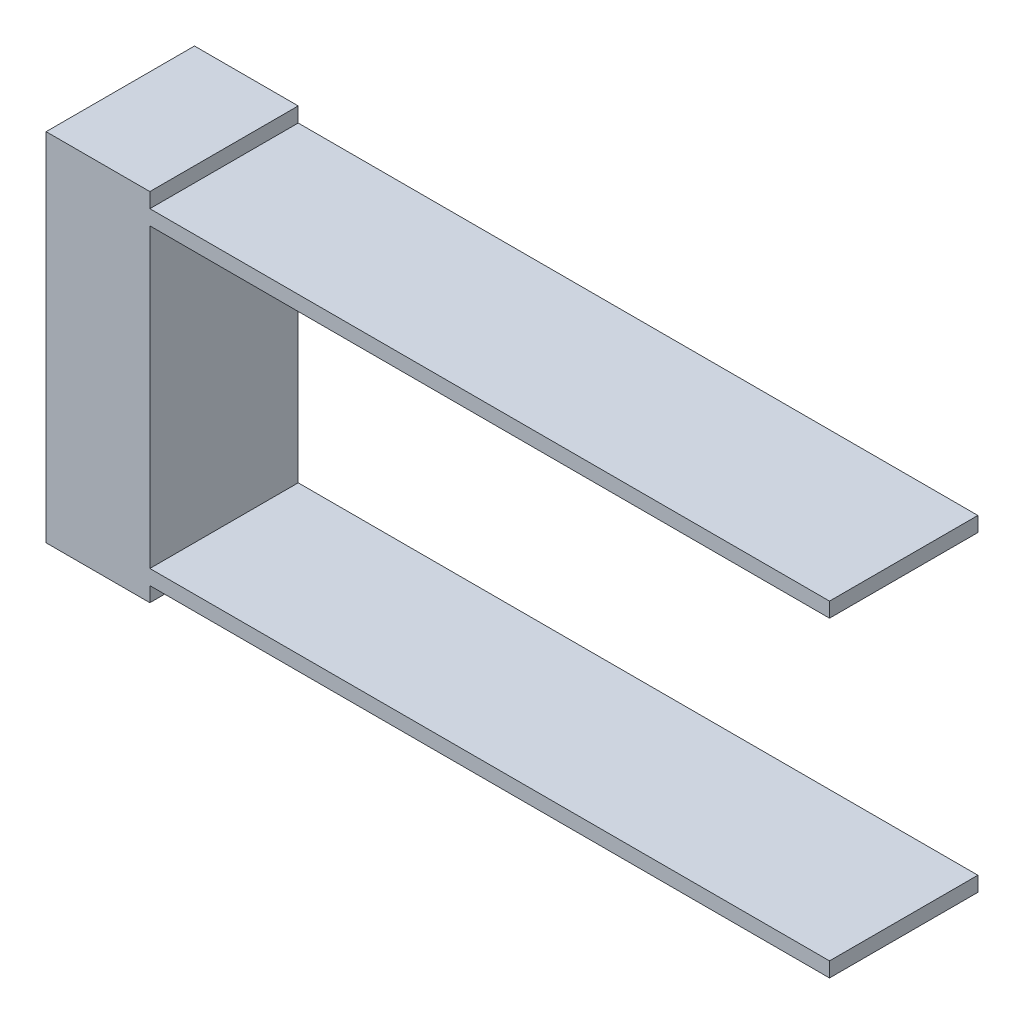
ISO-10303-21;
HEADER;
FILE_DESCRIPTION(('STEP AP214'),'2;1');
FILE_NAME('part.step','',(''),(''),'','','');
FILE_SCHEMA(('AUTOMOTIVE_DESIGN { 1 0 10303 214 1 1 1 1 }'));
ENDSEC;
DATA;
#1=APPLICATION_CONTEXT('core data for automotive mechanical design processes');
#2=APPLICATION_PROTOCOL_DEFINITION('international standard','automotive_design',2000,#1);
#3=PRODUCT_CONTEXT('',#1,'mechanical');
#4=PRODUCT('Part','Part','',(#3));
#5=PRODUCT_RELATED_PRODUCT_CATEGORY('part','',(#4));
#6=PRODUCT_DEFINITION_FORMATION('','',#4);
#7=PRODUCT_DEFINITION_CONTEXT('part definition',#1,'design');
#8=PRODUCT_DEFINITION('design','',#6,#7);
#9=PRODUCT_DEFINITION_SHAPE('','',#8);
#10=(LENGTH_UNIT() NAMED_UNIT(*) SI_UNIT(.MILLI.,.METRE.));
#11=(NAMED_UNIT(*) PLANE_ANGLE_UNIT() SI_UNIT($,.RADIAN.));
#12=(NAMED_UNIT(*) SI_UNIT($,.STERADIAN.) SOLID_ANGLE_UNIT());
#13=UNCERTAINTY_MEASURE_WITH_UNIT(LENGTH_MEASURE(1.E-05),#10,'distance_accuracy_value','');
#14=(GEOMETRIC_REPRESENTATION_CONTEXT(3) GLOBAL_UNCERTAINTY_ASSIGNED_CONTEXT((#13)) GLOBAL_UNIT_ASSIGNED_CONTEXT((#10,
#11,#12)) REPRESENTATION_CONTEXT('',''));
#15=CARTESIAN_POINT('',(0.,0.,0.));
#16=DIRECTION('',(0.,0.,1.));
#17=DIRECTION('',(1.,0.,0.));
#18=AXIS2_PLACEMENT_3D('',#15,#16,#17);
#19=CARTESIAN_POINT('',(-66.,30.,25.));
#20=DIRECTION('',(1.,0.,0.));
#21=DIRECTION('',(0.,1.,0.));
#22=AXIS2_PLACEMENT_3D('',#19,#20,#21);
#23=PLANE('',#22);
#24=DIRECTION('',(0.,-1.,0.));
#25=VECTOR('',#24,1.);
#26=CARTESIAN_POINT('',(-66.,30.,0.));
#27=LINE('',#26,#25);
#28=CARTESIAN_POINT('',(-66.,30.,0.));
#29=VERTEX_POINT('',#28);
#30=CARTESIAN_POINT('',(-66.,-30.,0.));
#31=VERTEX_POINT('',#30);
#32=EDGE_CURVE('E158',#29,#31,#27,.T.);
#33=ORIENTED_EDGE('',*,*,#32,.T.);
#34=DIRECTION('',(0.,0.,-1.));
#35=VECTOR('',#34,1.);
#36=CARTESIAN_POINT('',(-66.,-30.,25.));
#37=LINE('',#36,#35);
#38=CARTESIAN_POINT('',(-66.,-30.,25.));
#39=VERTEX_POINT('',#38);
#40=EDGE_CURVE('E11',#39,#31,#37,.T.);
#41=ORIENTED_EDGE('',*,*,#40,.F.);
#42=DIRECTION('',(0.,-1.,0.));
#43=VECTOR('',#42,1.);
#44=CARTESIAN_POINT('',(-66.,30.,25.));
#45=LINE('',#44,#43);
#46=CARTESIAN_POINT('',(-66.,30.,25.));
#47=VERTEX_POINT('',#46);
#48=EDGE_CURVE('E190',#47,#39,#45,.T.);
#49=ORIENTED_EDGE('',*,*,#48,.F.);
#50=DIRECTION('',(0.,0.,-1.));
#51=VECTOR('',#50,1.);
#52=CARTESIAN_POINT('',(-66.,30.,25.));
#53=LINE('',#52,#51);
#54=EDGE_CURVE('E53',#47,#29,#53,.T.);
#55=ORIENTED_EDGE('',*,*,#54,.T.);
#56=EDGE_LOOP('',(#33,#41,#49,#55));
#57=FACE_BOUND('',#56,.T.);
#58=ADVANCED_FACE('F37',(#57),#23,.F.);
#59=CARTESIAN_POINT('',(-66.,-30.,25.));
#60=DIRECTION('',(0.,1.,0.));
#61=DIRECTION('',(0.,0.,1.));
#62=AXIS2_PLACEMENT_3D('',#59,#60,#61);
#63=PLANE('',#62);
#64=DIRECTION('',(1.,0.,0.));
#65=VECTOR('',#64,1.);
#66=CARTESIAN_POINT('',(-66.,-30.,0.));
#67=LINE('',#66,#65);
#68=CARTESIAN_POINT('',(-48.520030234316,-30.,0.));
#69=VERTEX_POINT('',#68);
#70=EDGE_CURVE('E160',#31,#69,#67,.T.);
#71=ORIENTED_EDGE('',*,*,#70,.T.);
#72=DIRECTION('',(0.,0.,-1.));
#73=VECTOR('',#72,1.);
#74=CARTESIAN_POINT('',(-48.520030234316,-30.,25.));
#75=LINE('',#74,#73);
#76=CARTESIAN_POINT('',(-48.520030234316,-30.,25.));
#77=VERTEX_POINT('',#76);
#78=EDGE_CURVE('E45',#77,#69,#75,.T.);
#79=ORIENTED_EDGE('',*,*,#78,.F.);
#80=DIRECTION('',(1.,0.,0.));
#81=VECTOR('',#80,1.);
#82=CARTESIAN_POINT('',(-66.,-30.,25.));
#83=LINE('',#82,#81);
#84=EDGE_CURVE('E103',#39,#77,#83,.T.);
#85=ORIENTED_EDGE('',*,*,#84,.F.);
#86=ORIENTED_EDGE('',*,*,#40,.T.);
#87=EDGE_LOOP('',(#71,#79,#85,#86));
#88=FACE_BOUND('',#87,.T.);
#89=ADVANCED_FACE('F211',(#88),#63,.F.);
#90=CARTESIAN_POINT('',(-48.520030234316,-27.5,25.));
#91=DIRECTION('',(1.,0.,0.));
#92=DIRECTION('',(0.,1.,0.));
#93=AXIS2_PLACEMENT_3D('',#90,#91,#92);
#94=PLANE('',#93);
#95=DIRECTION('',(0.,-1.,0.));
#96=VECTOR('',#95,1.);
#97=CARTESIAN_POINT('',(-48.520030234316,-27.5,0.));
#98=LINE('',#97,#96);
#99=CARTESIAN_POINT('',(-48.520030234316,-27.5,0.));
#100=VERTEX_POINT('',#99);
#101=EDGE_CURVE('E163',#100,#69,#98,.T.);
#102=ORIENTED_EDGE('',*,*,#101,.F.);
#103=DIRECTION('',(0.,0.,-1.));
#104=VECTOR('',#103,1.);
#105=CARTESIAN_POINT('',(-48.520030234316,-27.5,25.));
#106=LINE('',#105,#104);
#107=CARTESIAN_POINT('',(-48.520030234316,-27.5,25.));
#108=VERTEX_POINT('',#107);
#109=EDGE_CURVE('E204',#108,#100,#106,.T.);
#110=ORIENTED_EDGE('',*,*,#109,.F.);
#111=DIRECTION('',(0.,-1.,0.));
#112=VECTOR('',#111,1.);
#113=CARTESIAN_POINT('',(-48.520030234316,-27.5,25.));
#114=LINE('',#113,#112);
#115=EDGE_CURVE('E210',#108,#77,#114,.T.);
#116=ORIENTED_EDGE('',*,*,#115,.T.);
#117=ORIENTED_EDGE('',*,*,#78,.T.);
#118=EDGE_LOOP('',(#102,#110,#116,#117));
#119=FACE_BOUND('',#118,.T.);
#120=ADVANCED_FACE('F208',(#119),#94,.T.);
#121=CARTESIAN_POINT('',(-48.520030234316,-27.5,25.));
#122=DIRECTION('',(0.,1.,0.));
#123=DIRECTION('',(0.,0.,1.));
#124=AXIS2_PLACEMENT_3D('',#121,#122,#123);
#125=PLANE('',#124);
#126=DIRECTION('',(1.,0.,0.));
#127=VECTOR('',#126,1.);
#128=CARTESIAN_POINT('',(-48.520030234316,-27.5,0.));
#129=LINE('',#128,#127);
#130=CARTESIAN_POINT('',(66.,-27.5,0.));
#131=VERTEX_POINT('',#130);
#132=EDGE_CURVE('E166',#100,#131,#129,.T.);
#133=ORIENTED_EDGE('',*,*,#132,.T.);
#134=DIRECTION('',(0.,0.,-1.));
#135=VECTOR('',#134,1.);
#136=CARTESIAN_POINT('',(66.,-27.5,25.));
#137=LINE('',#136,#135);
#138=CARTESIAN_POINT('',(66.,-27.5,25.));
#139=VERTEX_POINT('',#138);
#140=EDGE_CURVE('E202',#139,#131,#137,.T.);
#141=ORIENTED_EDGE('',*,*,#140,.F.);
#142=DIRECTION('',(1.,0.,0.));
#143=VECTOR('',#142,1.);
#144=CARTESIAN_POINT('',(-48.520030234316,-27.5,25.));
#145=LINE('',#144,#143);
#146=EDGE_CURVE('E222',#108,#139,#145,.T.);
#147=ORIENTED_EDGE('',*,*,#146,.F.);
#148=ORIENTED_EDGE('',*,*,#109,.T.);
#149=EDGE_LOOP('',(#133,#141,#147,#148));
#150=FACE_BOUND('',#149,.T.);
#151=ADVANCED_FACE('F219',(#150),#125,.F.);
#152=CARTESIAN_POINT('',(66.,-25.,25.));
#153=DIRECTION('',(1.,0.,0.));
#154=DIRECTION('',(0.,0.,-1.));
#155=AXIS2_PLACEMENT_3D('',#152,#153,#154);
#156=PLANE('',#155);
#157=DIRECTION('',(0.,-1.,0.));
#158=VECTOR('',#157,1.);
#159=CARTESIAN_POINT('',(66.,-25.,0.));
#160=LINE('',#159,#158);
#161=CARTESIAN_POINT('',(66.,-25.,0.));
#162=VERTEX_POINT('',#161);
#163=EDGE_CURVE('E169',#162,#131,#160,.T.);
#164=ORIENTED_EDGE('',*,*,#163,.F.);
#165=DIRECTION('',(0.,0.,-1.));
#166=VECTOR('',#165,1.);
#167=CARTESIAN_POINT('',(66.,-25.,25.));
#168=LINE('',#167,#166);
#169=CARTESIAN_POINT('',(66.,-25.,25.));
#170=VERTEX_POINT('',#169);
#171=EDGE_CURVE('E200',#170,#162,#168,.T.);
#172=ORIENTED_EDGE('',*,*,#171,.F.);
#173=DIRECTION('',(0.,-1.,0.));
#174=VECTOR('',#173,1.);
#175=CARTESIAN_POINT('',(66.,-25.,25.));
#176=LINE('',#175,#174);
#177=EDGE_CURVE('E224',#170,#139,#176,.T.);
#178=ORIENTED_EDGE('',*,*,#177,.T.);
#179=ORIENTED_EDGE('',*,*,#140,.T.);
#180=EDGE_LOOP('',(#164,#172,#178,#179));
#181=FACE_BOUND('',#180,.T.);
#182=ADVANCED_FACE('F264',(#181),#156,.T.);
#183=CARTESIAN_POINT('',(-48.520030234316,-25.,25.));
#184=DIRECTION('',(0.,1.,0.));
#185=DIRECTION('',(0.,0.,1.));
#186=AXIS2_PLACEMENT_3D('',#183,#184,#185);
#187=PLANE('',#186);
#188=DIRECTION('',(1.,0.,0.));
#189=VECTOR('',#188,1.);
#190=CARTESIAN_POINT('',(-48.520030234316,-25.,0.));
#191=LINE('',#190,#189);
#192=CARTESIAN_POINT('',(-48.520030234316,-25.,0.));
#193=VERTEX_POINT('',#192);
#194=EDGE_CURVE('E172',#193,#162,#191,.T.);
#195=ORIENTED_EDGE('',*,*,#194,.F.);
#196=DIRECTION('',(0.,0.,-1.));
#197=VECTOR('',#196,1.);
#198=CARTESIAN_POINT('',(-48.520030234316,-25.,25.));
#199=LINE('',#198,#197);
#200=CARTESIAN_POINT('',(-48.520030234316,-25.,25.));
#201=VERTEX_POINT('',#200);
#202=EDGE_CURVE('E198',#201,#193,#199,.T.);
#203=ORIENTED_EDGE('',*,*,#202,.F.);
#204=DIRECTION('',(1.,0.,0.));
#205=VECTOR('',#204,1.);
#206=CARTESIAN_POINT('',(-48.520030234316,-25.,25.));
#207=LINE('',#206,#205);
#208=EDGE_CURVE('E231',#201,#170,#207,.T.);
#209=ORIENTED_EDGE('',*,*,#208,.T.);
#210=ORIENTED_EDGE('',*,*,#171,.T.);
#211=EDGE_LOOP('',(#195,#203,#209,#210));
#212=FACE_BOUND('',#211,.T.);
#213=ADVANCED_FACE('F267',(#212),#187,.T.);
#214=CARTESIAN_POINT('',(-48.520030234316,25.,25.));
#215=DIRECTION('',(1.,0.,0.));
#216=DIRECTION('',(0.,0.,-1.));
#217=AXIS2_PLACEMENT_3D('',#214,#215,#216);
#218=PLANE('',#217);
#219=DIRECTION('',(0.,-1.,0.));
#220=VECTOR('',#219,1.);
#221=CARTESIAN_POINT('',(-48.520030234316,25.,0.));
#222=LINE('',#221,#220);
#223=CARTESIAN_POINT('',(-48.520030234316,25.,0.));
#224=VERTEX_POINT('',#223);
#225=EDGE_CURVE('E175',#224,#193,#222,.T.);
#226=ORIENTED_EDGE('',*,*,#225,.F.);
#227=DIRECTION('',(0.,0.,-1.));
#228=VECTOR('',#227,1.);
#229=CARTESIAN_POINT('',(-48.520030234316,25.,25.));
#230=LINE('',#229,#228);
#231=CARTESIAN_POINT('',(-48.520030234316,25.,25.));
#232=VERTEX_POINT('',#231);
#233=EDGE_CURVE('E196',#232,#224,#230,.T.);
#234=ORIENTED_EDGE('',*,*,#233,.F.);
#235=DIRECTION('',(0.,-1.,0.));
#236=VECTOR('',#235,1.);
#237=CARTESIAN_POINT('',(-48.520030234316,25.,25.));
#238=LINE('',#237,#236);
#239=EDGE_CURVE('E234',#232,#201,#238,.T.);
#240=ORIENTED_EDGE('',*,*,#239,.T.);
#241=ORIENTED_EDGE('',*,*,#202,.T.);
#242=EDGE_LOOP('',(#226,#234,#240,#241));
#243=FACE_BOUND('',#242,.T.);
#244=ADVANCED_FACE('F271',(#243),#218,.T.);
#245=CARTESIAN_POINT('',(66.,25.,25.));
#246=DIRECTION('',(0.,-1.,0.));
#247=DIRECTION('',(0.,0.,-1.));
#248=AXIS2_PLACEMENT_3D('',#245,#246,#247);
#249=PLANE('',#248);
#250=DIRECTION('',(-1.,0.,0.));
#251=VECTOR('',#250,1.);
#252=CARTESIAN_POINT('',(66.,25.,0.));
#253=LINE('',#252,#251);
#254=CARTESIAN_POINT('',(66.,25.,0.));
#255=VERTEX_POINT('',#254);
#256=EDGE_CURVE('E178',#255,#224,#253,.T.);
#257=ORIENTED_EDGE('',*,*,#256,.F.);
#258=DIRECTION('',(0.,0.,-1.));
#259=VECTOR('',#258,1.);
#260=CARTESIAN_POINT('',(66.,25.,25.));
#261=LINE('',#260,#259);
#262=CARTESIAN_POINT('',(66.,25.,25.));
#263=VERTEX_POINT('',#262);
#264=EDGE_CURVE('E194',#263,#255,#261,.T.);
#265=ORIENTED_EDGE('',*,*,#264,.F.);
#266=DIRECTION('',(-1.,0.,0.));
#267=VECTOR('',#266,1.);
#268=CARTESIAN_POINT('',(66.,25.,25.));
#269=LINE('',#268,#267);
#270=EDGE_CURVE('E237',#263,#232,#269,.T.);
#271=ORIENTED_EDGE('',*,*,#270,.T.);
#272=ORIENTED_EDGE('',*,*,#233,.T.);
#273=EDGE_LOOP('',(#257,#265,#271,#272));
#274=FACE_BOUND('',#273,.T.);
#275=ADVANCED_FACE('F275',(#274),#249,.T.);
#276=CARTESIAN_POINT('',(66.,27.5,25.));
#277=DIRECTION('',(1.,0.,0.));
#278=DIRECTION('',(0.,0.,-1.));
#279=AXIS2_PLACEMENT_3D('',#276,#277,#278);
#280=PLANE('',#279);
#281=DIRECTION('',(0.,-1.,0.));
#282=VECTOR('',#281,1.);
#283=CARTESIAN_POINT('',(66.,27.5,0.));
#284=LINE('',#283,#282);
#285=CARTESIAN_POINT('',(66.,27.5,0.));
#286=VERTEX_POINT('',#285);
#287=EDGE_CURVE('E181',#286,#255,#284,.T.);
#288=ORIENTED_EDGE('',*,*,#287,.F.);
#289=DIRECTION('',(0.,0.,-1.));
#290=VECTOR('',#289,1.);
#291=CARTESIAN_POINT('',(66.,27.5,25.));
#292=LINE('',#291,#290);
#293=CARTESIAN_POINT('',(66.,27.5,25.));
#294=VERTEX_POINT('',#293);
#295=EDGE_CURVE('E150',#294,#286,#292,.T.);
#296=ORIENTED_EDGE('',*,*,#295,.F.);
#297=DIRECTION('',(0.,-1.,0.));
#298=VECTOR('',#297,1.);
#299=CARTESIAN_POINT('',(66.,27.5,25.));
#300=LINE('',#299,#298);
#301=EDGE_CURVE('E140',#294,#263,#300,.T.);
#302=ORIENTED_EDGE('',*,*,#301,.T.);
#303=ORIENTED_EDGE('',*,*,#264,.T.);
#304=EDGE_LOOP('',(#288,#296,#302,#303));
#305=FACE_BOUND('',#304,.T.);
#306=ADVANCED_FACE('F241',(#305),#280,.T.);
#307=CARTESIAN_POINT('',(66.,27.5,25.));
#308=DIRECTION('',(0.,-1.,0.));
#309=DIRECTION('',(0.,0.,-1.));
#310=AXIS2_PLACEMENT_3D('',#307,#308,#309);
#311=PLANE('',#310);
#312=DIRECTION('',(-1.,0.,0.));
#313=VECTOR('',#312,1.);
#314=CARTESIAN_POINT('',(66.,27.5,0.));
#315=LINE('',#314,#313);
#316=CARTESIAN_POINT('',(-48.520030234316,27.5,0.));
#317=VERTEX_POINT('',#316);
#318=EDGE_CURVE('E147',#286,#317,#315,.T.);
#319=ORIENTED_EDGE('',*,*,#318,.T.);
#320=DIRECTION('',(0.,0.,-1.));
#321=VECTOR('',#320,1.);
#322=CARTESIAN_POINT('',(-48.520030234316,27.5,25.));
#323=LINE('',#322,#321);
#324=CARTESIAN_POINT('',(-48.520030234316,27.5,25.));
#325=VERTEX_POINT('',#324);
#326=EDGE_CURVE('E144',#325,#317,#323,.T.);
#327=ORIENTED_EDGE('',*,*,#326,.F.);
#328=DIRECTION('',(-1.,0.,0.));
#329=VECTOR('',#328,1.);
#330=CARTESIAN_POINT('',(66.,27.5,25.));
#331=LINE('',#330,#329);
#332=EDGE_CURVE('E132',#294,#325,#331,.T.);
#333=ORIENTED_EDGE('',*,*,#332,.F.);
#334=ORIENTED_EDGE('',*,*,#295,.T.);
#335=EDGE_LOOP('',(#319,#327,#333,#334));
#336=FACE_BOUND('',#335,.T.);
#337=ADVANCED_FACE('F145',(#336),#311,.F.);
#338=CARTESIAN_POINT('',(-48.520030234316,30.,25.));
#339=DIRECTION('',(1.,0.,0.));
#340=DIRECTION('',(0.,1.,0.));
#341=AXIS2_PLACEMENT_3D('',#338,#339,#340);
#342=PLANE('',#341);
#343=DIRECTION('',(0.,-1.,0.));
#344=VECTOR('',#343,1.);
#345=CARTESIAN_POINT('',(-48.520030234316,30.,0.));
#346=LINE('',#345,#344);
#347=CARTESIAN_POINT('',(-48.520030234316,30.,0.));
#348=VERTEX_POINT('',#347);
#349=EDGE_CURVE('E185',#348,#317,#346,.T.);
#350=ORIENTED_EDGE('',*,*,#349,.F.);
#351=DIRECTION('',(0.,0.,-1.));
#352=VECTOR('',#351,1.);
#353=CARTESIAN_POINT('',(-48.520030234316,30.,25.));
#354=LINE('',#353,#352);
#355=CARTESIAN_POINT('',(-48.520030234316,30.,25.));
#356=VERTEX_POINT('',#355);
#357=EDGE_CURVE('E91',#356,#348,#354,.T.);
#358=ORIENTED_EDGE('',*,*,#357,.F.);
#359=DIRECTION('',(0.,-1.,0.));
#360=VECTOR('',#359,1.);
#361=CARTESIAN_POINT('',(-48.520030234316,30.,25.));
#362=LINE('',#361,#360);
#363=EDGE_CURVE('E137',#356,#325,#362,.T.);
#364=ORIENTED_EDGE('',*,*,#363,.T.);
#365=ORIENTED_EDGE('',*,*,#326,.T.);
#366=EDGE_LOOP('',(#350,#358,#364,#365));
#367=FACE_BOUND('',#366,.T.);
#368=ADVANCED_FACE('F152',(#367),#342,.T.);
#369=CARTESIAN_POINT('',(-66.,30.,25.));
#370=DIRECTION('',(0.,1.,0.));
#371=DIRECTION('',(0.,0.,1.));
#372=AXIS2_PLACEMENT_3D('',#369,#370,#371);
#373=PLANE('',#372);
#374=DIRECTION('',(1.,0.,0.));
#375=VECTOR('',#374,1.);
#376=CARTESIAN_POINT('',(-66.,30.,0.));
#377=LINE('',#376,#375);
#378=EDGE_CURVE('E187',#29,#348,#377,.T.);
#379=ORIENTED_EDGE('',*,*,#378,.F.);
#380=ORIENTED_EDGE('',*,*,#54,.F.);
#381=DIRECTION('',(1.,0.,0.));
#382=VECTOR('',#381,1.);
#383=CARTESIAN_POINT('',(-66.,30.,25.));
#384=LINE('',#383,#382);
#385=EDGE_CURVE('E153',#47,#356,#384,.T.);
#386=ORIENTED_EDGE('',*,*,#385,.T.);
#387=ORIENTED_EDGE('',*,*,#357,.T.);
#388=EDGE_LOOP('',(#379,#380,#386,#387));
#389=FACE_BOUND('',#388,.T.);
#390=ADVANCED_FACE('F243',(#389),#373,.T.);
#391=CARTESIAN_POINT('',(0.,0.,25.));
#392=DIRECTION('',(0.,0.,1.));
#393=DIRECTION('',(1.,0.,0.));
#394=AXIS2_PLACEMENT_3D('',#391,#392,#393);
#395=PLANE('',#394);
#396=ORIENTED_EDGE('',*,*,#48,.T.);
#397=ORIENTED_EDGE('',*,*,#84,.T.);
#398=ORIENTED_EDGE('',*,*,#115,.F.);
#399=ORIENTED_EDGE('',*,*,#146,.T.);
#400=ORIENTED_EDGE('',*,*,#177,.F.);
#401=ORIENTED_EDGE('',*,*,#208,.F.);
#402=ORIENTED_EDGE('',*,*,#239,.F.);
#403=ORIENTED_EDGE('',*,*,#270,.F.);
#404=ORIENTED_EDGE('',*,*,#301,.F.);
#405=ORIENTED_EDGE('',*,*,#332,.T.);
#406=ORIENTED_EDGE('',*,*,#363,.F.);
#407=ORIENTED_EDGE('',*,*,#385,.F.);
#408=EDGE_LOOP('',(#396,#397,#398,#399,#400,#401,#402,#403,#404,#405,#406,#407));
#409=FACE_BOUND('',#408,.T.);
#410=ADVANCED_FACE('F134',(#409),#395,.T.);
#411=CARTESIAN_POINT('',(0.,0.,0.));
#412=DIRECTION('',(0.,0.,1.));
#413=DIRECTION('',(1.,0.,0.));
#414=AXIS2_PLACEMENT_3D('',#411,#412,#413);
#415=PLANE('',#414);
#416=ORIENTED_EDGE('',*,*,#32,.F.);
#417=ORIENTED_EDGE('',*,*,#378,.T.);
#418=ORIENTED_EDGE('',*,*,#349,.T.);
#419=ORIENTED_EDGE('',*,*,#318,.F.);
#420=ORIENTED_EDGE('',*,*,#287,.T.);
#421=ORIENTED_EDGE('',*,*,#256,.T.);
#422=ORIENTED_EDGE('',*,*,#225,.T.);
#423=ORIENTED_EDGE('',*,*,#194,.T.);
#424=ORIENTED_EDGE('',*,*,#163,.T.);
#425=ORIENTED_EDGE('',*,*,#132,.F.);
#426=ORIENTED_EDGE('',*,*,#101,.T.);
#427=ORIENTED_EDGE('',*,*,#70,.F.);
#428=EDGE_LOOP('',(#416,#417,#418,#419,#420,#421,#422,#423,#424,#425,#426,#427));
#429=FACE_BOUND('',#428,.T.);
#430=ADVANCED_FACE('F215',(#429),#415,.F.);
#431=CLOSED_SHELL('',(#58,#89,#120,#151,#182,#213,#244,#275,#306,#337,#368,#390,#410,#430));
#432=MANIFOLD_SOLID_BREP('B2',#431);
#433=ADVANCED_BREP_SHAPE_REPRESENTATION('',(#18,#432),#14);
#434=SHAPE_DEFINITION_REPRESENTATION(#9,#433);
ENDSEC;
END-ISO-10303-21;
